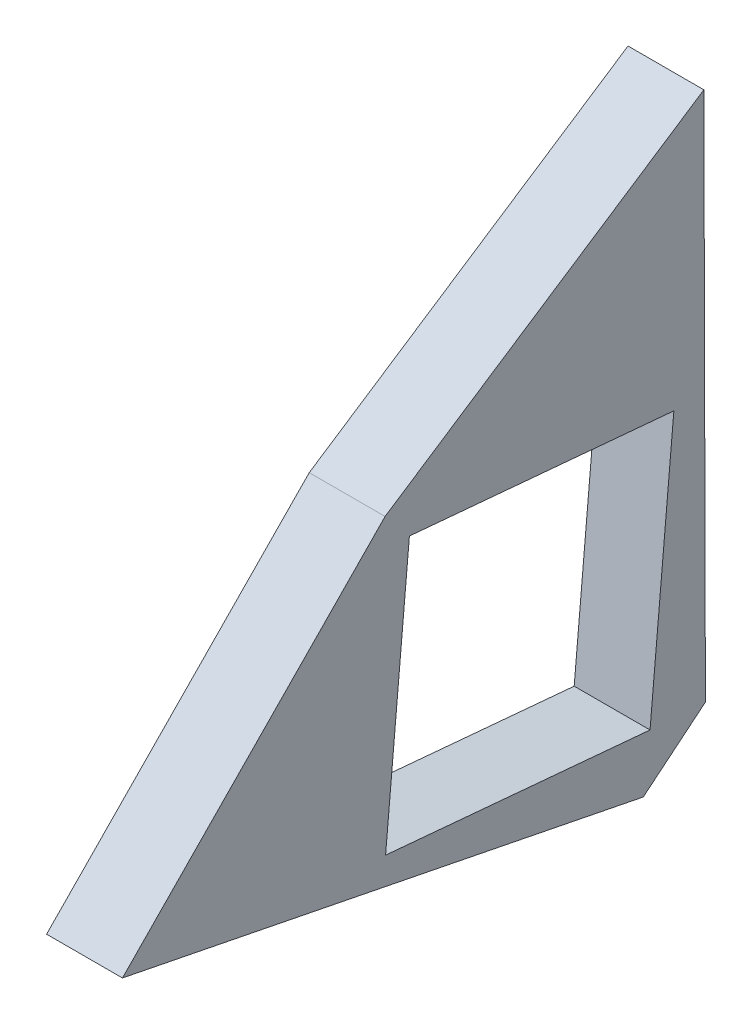
ISO-10303-21;
HEADER;
FILE_DESCRIPTION(('STEP AP214'),'2;1');
FILE_NAME('part.step','',(''),(''),'','','');
FILE_SCHEMA(('AUTOMOTIVE_DESIGN { 1 0 10303 214 1 1 1 1 }'));
ENDSEC;
DATA;
#1=APPLICATION_CONTEXT('core data for automotive mechanical design processes');
#2=APPLICATION_PROTOCOL_DEFINITION('international standard','automotive_design',2000,#1);
#3=PRODUCT_CONTEXT('',#1,'mechanical');
#4=PRODUCT('Part','Part','',(#3));
#5=PRODUCT_RELATED_PRODUCT_CATEGORY('part','',(#4));
#6=PRODUCT_DEFINITION_FORMATION('','',#4);
#7=PRODUCT_DEFINITION_CONTEXT('part definition',#1,'design');
#8=PRODUCT_DEFINITION('design','',#6,#7);
#9=PRODUCT_DEFINITION_SHAPE('','',#8);
#10=(LENGTH_UNIT() NAMED_UNIT(*) SI_UNIT(.MILLI.,.METRE.));
#11=(NAMED_UNIT(*) PLANE_ANGLE_UNIT() SI_UNIT($,.RADIAN.));
#12=(NAMED_UNIT(*) SI_UNIT($,.STERADIAN.) SOLID_ANGLE_UNIT());
#13=UNCERTAINTY_MEASURE_WITH_UNIT(LENGTH_MEASURE(1.E-05),#10,'distance_accuracy_value','');
#14=(GEOMETRIC_REPRESENTATION_CONTEXT(3) GLOBAL_UNCERTAINTY_ASSIGNED_CONTEXT((#13)) GLOBAL_UNIT_ASSIGNED_CONTEXT((#10,
#11,#12)) REPRESENTATION_CONTEXT('',''));
#15=CARTESIAN_POINT('',(0.,0.,0.));
#16=DIRECTION('',(0.,0.,1.));
#17=DIRECTION('',(1.,0.,0.));
#18=AXIS2_PLACEMENT_3D('',#15,#16,#17);
#19=CARTESIAN_POINT('',(4.00000000011332,0.,0.));
#20=DIRECTION('',(1.,0.,0.));
#21=DIRECTION('',(0.,1.,0.));
#22=AXIS2_PLACEMENT_3D('',#19,#20,#21);
#23=PLANE('',#22);
#24=DIRECTION('',(0.,0.195238956565087,0.980755703444735));
#25=VECTOR('',#24,1.);
#26=CARTESIAN_POINT('',(4.00000000011326,-12.2359621531208,-3.39641834524961));
#27=LINE('',#26,#25);
#28=CARTESIAN_POINT('',(4.00000000011326,-12.2359621531208,-3.39641834524961));
#29=VERTEX_POINT('',#28);
#30=CARTESIAN_POINT('',(4.00000000011333,-6.76927136930034,24.0647413511931));
#31=VERTEX_POINT('',#30);
#32=EDGE_CURVE('E45',#29,#31,#27,.T.);
#33=ORIENTED_EDGE('',*,*,#32,.F.);
#34=DIRECTION('',(0.,-0.635389526853681,0.772191782632175));
#35=VECTOR('',#34,1.);
#36=CARTESIAN_POINT('',(4.0000000001133,-9.54023269249155,-6.6725506227285));
#37=LINE('',#36,#35);
#38=CARTESIAN_POINT('',(4.0000000001133,-9.54023269249155,-6.6725506227285));
#39=VERTEX_POINT('',#38);
#40=EDGE_CURVE('E122',#39,#29,#37,.T.);
#41=ORIENTED_EDGE('',*,*,#40,.F.);
#42=DIRECTION('',(0.,-0.999995813600607,-0.00289357586033156));
#43=VECTOR('',#42,1.);
#44=CARTESIAN_POINT('',(4.00000000011369,18.4596500883253,-6.59153049863922));
#45=LINE('',#44,#43);
#46=CARTESIAN_POINT('',(4.00000000011369,18.4596500883253,-6.59153049863922));
#47=VERTEX_POINT('',#46);
#48=EDGE_CURVE('E164',#47,#39,#45,.T.);
#49=ORIENTED_EDGE('',*,*,#48,.F.);
#50=DIRECTION('',(0.,0.550297121991585,-0.834968908120403));
#51=VECTOR('',#50,1.);
#52=CARTESIAN_POINT('',(4.00000000011369,18.4596500883253,-6.59153049863922));
#53=LINE('',#52,#51);
#54=CARTESIAN_POINT('',(4.00000000011353,7.38216902263471,10.2163936218245));
#55=VERTEX_POINT('',#54);
#56=EDGE_CURVE('E199',#55,#47,#53,.T.);
#57=ORIENTED_EDGE('',*,*,#56,.F.);
#58=DIRECTION('',(0.,0.714719211713891,-0.699411501483264));
#59=VECTOR('',#58,1.);
#60=CARTESIAN_POINT('',(4.00000000011353,7.38216902263471,10.2163936218245));
#61=LINE('',#60,#59);
#62=EDGE_CURVE('E179',#31,#55,#61,.T.);
#63=ORIENTED_EDGE('',*,*,#62,.F.);
#64=EDGE_LOOP('',(#33,#41,#49,#57,#63));
#65=FACE_BOUND('',#64,.T.);
#66=DIRECTION('',(0.,0.995967843660256,-0.0897109491352087));
#67=VECTOR('',#66,1.);
#68=CARTESIAN_POINT('',(4.00000000011351,5.84678734948251,8.93475283059304));
#69=LINE('',#68,#67);
#70=CARTESIAN_POINT('',(4.0000000001133,-8.09676246176107,10.190706118486));
#71=VERTEX_POINT('',#70);
#72=CARTESIAN_POINT('',(4.00000000011351,5.84678734948251,8.93475283059304));
#73=VERTEX_POINT('',#72);
#74=EDGE_CURVE('E148',#71,#73,#69,.T.);
#75=ORIENTED_EDGE('',*,*,#74,.T.);
#76=DIRECTION('',(0.,-0.0897109491352088,-0.995967843660256));
#77=VECTOR('',#76,1.);
#78=CARTESIAN_POINT('',(4.00000000011351,4.59083406158959,-5.00879698065055));
#79=LINE('',#78,#77);
#80=CARTESIAN_POINT('',(4.00000000011351,4.59083406158959,-5.00879698065055));
#81=VERTEX_POINT('',#80);
#82=EDGE_CURVE('E135',#73,#81,#79,.T.);
#83=ORIENTED_EDGE('',*,*,#82,.T.);
#84=DIRECTION('',(0.,-0.995967843660256,0.0897109491352097));
#85=VECTOR('',#84,1.);
#86=CARTESIAN_POINT('',(4.00000000011351,4.59083406158959,-5.00879698065055));
#87=LINE('',#86,#85);
#88=CARTESIAN_POINT('',(4.0000000001132,-9.35271574965399,-3.75284369275761));
#89=VERTEX_POINT('',#88);
#90=EDGE_CURVE('E123',#81,#89,#87,.T.);
#91=ORIENTED_EDGE('',*,*,#90,.T.);
#92=DIRECTION('',(0.,0.0897109491352086,0.995967843660256));
#93=VECTOR('',#92,1.);
#94=CARTESIAN_POINT('',(4.0000000001133,-9.35271574965399,-3.75284369275761));
#95=LINE('',#94,#93);
#96=EDGE_CURVE('E53',#89,#71,#95,.T.);
#97=ORIENTED_EDGE('',*,*,#96,.T.);
#98=EDGE_LOOP('',(#75,#83,#91,#97));
#99=FACE_BOUND('',#98,.T.);
#100=ADVANCED_FACE('F37',(#65,#99),#23,.T.);
#101=CARTESIAN_POINT('',(1.13322971756654E-10,0.,0.));
#102=DIRECTION('',(1.,0.,0.));
#103=DIRECTION('',(0.,1.,0.));
#104=AXIS2_PLACEMENT_3D('',#101,#102,#103);
#105=PLANE('',#104);
#106=DIRECTION('',(0.,0.195238956565087,0.980755703444735));
#107=VECTOR('',#106,1.);
#108=CARTESIAN_POINT('',(1.13261718405955E-10,-12.2359621531208,-3.39641834524961));
#109=LINE('',#108,#107);
#110=CARTESIAN_POINT('',(1.13261718405955E-10,-12.2359621531208,-3.39641834524961));
#111=VERTEX_POINT('',#110);
#112=CARTESIAN_POINT('',(1.13333813892035E-10,-6.76927136930034,24.0647413511931));
#113=VERTEX_POINT('',#112);
#114=EDGE_CURVE('E12',#111,#113,#109,.T.);
#115=ORIENTED_EDGE('',*,*,#114,.T.);
#116=DIRECTION('',(0.,0.714719211713891,-0.699411501483264));
#117=VECTOR('',#116,1.);
#118=CARTESIAN_POINT('',(1.13533143905012E-10,7.38216902263471,10.2163936218245));
#119=LINE('',#118,#117);
#120=CARTESIAN_POINT('',(1.13533143905012E-10,7.38216902263471,10.2163936218245));
#121=VERTEX_POINT('',#120);
#122=EDGE_CURVE('E178',#113,#121,#119,.T.);
#123=ORIENTED_EDGE('',*,*,#122,.T.);
#124=DIRECTION('',(0.,0.550297121991585,-0.834968908120403));
#125=VECTOR('',#124,1.);
#126=CARTESIAN_POINT('',(1.13688853541484E-10,18.4596500883253,-6.59153049863922));
#127=LINE('',#126,#125);
#128=CARTESIAN_POINT('',(1.13688853541484E-10,18.4596500883253,-6.59153049863922));
#129=VERTEX_POINT('',#128);
#130=EDGE_CURVE('E193',#121,#129,#127,.T.);
#131=ORIENTED_EDGE('',*,*,#130,.T.);
#132=DIRECTION('',(0.,-0.999995813600607,-0.00289357586033156));
#133=VECTOR('',#132,1.);
#134=CARTESIAN_POINT('',(1.13688853541484E-10,18.4596500883253,-6.59153049863922));
#135=LINE('',#134,#133);
#136=CARTESIAN_POINT('',(1.13298889235523E-10,-9.54023269249155,-6.6725506227285));
#137=VERTEX_POINT('',#136);
#138=EDGE_CURVE('E207',#129,#137,#135,.T.);
#139=ORIENTED_EDGE('',*,*,#138,.T.);
#140=DIRECTION('',(0.,-0.635389526853681,0.772191782632175));
#141=VECTOR('',#140,1.);
#142=CARTESIAN_POINT('',(1.13298889235523E-10,-9.54023269249155,-6.6725506227285));
#143=LINE('',#142,#141);
#144=EDGE_CURVE('E165',#137,#111,#143,.T.);
#145=ORIENTED_EDGE('',*,*,#144,.T.);
#146=EDGE_LOOP('',(#115,#123,#131,#139,#145));
#147=FACE_BOUND('',#146,.T.);
#148=DIRECTION('',(0.,-0.0897109491352088,-0.995967843660256));
#149=VECTOR('',#148,1.);
#150=CARTESIAN_POINT('',(1.1351104069263E-10,4.59083406158959,-5.00879698065055));
#151=LINE('',#150,#149);
#152=CARTESIAN_POINT('',(1.13511888855576E-10,5.84678734948251,8.93475283059304));
#153=VERTEX_POINT('',#152);
#154=CARTESIAN_POINT('',(1.13342295141306E-10,4.59083406158959,-5.00879698065055));
#155=VERTEX_POINT('',#154);
#156=EDGE_CURVE('E61',#153,#155,#151,.T.);
#157=ORIENTED_EDGE('',*,*,#156,.F.);
#158=DIRECTION('',(0.,0.995967843660256,-0.0897109491352087));
#159=VECTOR('',#158,1.);
#160=CARTESIAN_POINT('',(1.13511888855576E-10,5.84678734948251,8.93475283059304));
#161=LINE('',#160,#159);
#162=CARTESIAN_POINT('',(1.13301732027774E-10,-8.09676246176107,10.190706118486));
#163=VERTEX_POINT('',#162);
#164=EDGE_CURVE('E127',#163,#153,#161,.T.);
#165=ORIENTED_EDGE('',*,*,#164,.F.);
#166=DIRECTION('',(0.,0.0897109491352086,0.995967843660256));
#167=VECTOR('',#166,1.);
#168=CARTESIAN_POINT('',(1.13301474601315E-10,-9.35271574965399,-3.75284369275761));
#169=LINE('',#168,#167);
#170=CARTESIAN_POINT('',(1.13301474601315E-10,-9.35271574965399,-3.75284369275761));
#171=VERTEX_POINT('',#170);
#172=EDGE_CURVE('E111',#171,#163,#169,.T.);
#173=ORIENTED_EDGE('',*,*,#172,.F.);
#174=DIRECTION('',(0.,-0.995967843660256,0.0897109491352097));
#175=VECTOR('',#174,1.);
#176=CARTESIAN_POINT('',(1.1351104069263E-10,4.59083406158959,-5.00879698065055));
#177=LINE('',#176,#175);
#178=EDGE_CURVE('E118',#155,#171,#177,.T.);
#179=ORIENTED_EDGE('',*,*,#178,.F.);
#180=EDGE_LOOP('',(#157,#165,#173,#179));
#181=FACE_BOUND('',#180,.T.);
#182=ADVANCED_FACE('F125',(#147,#181),#105,.F.);
#183=CARTESIAN_POINT('',(1.13298889235523E-10,-9.54023269249155,-6.6725506227285));
#184=DIRECTION('',(0.,0.772191782632175,0.635389526853681));
#185=DIRECTION('',(0.,-0.635389526853681,0.772191782632175));
#186=AXIS2_PLACEMENT_3D('',#183,#184,#185);
#187=PLANE('',#186);
#188=ORIENTED_EDGE('',*,*,#40,.T.);
#189=DIRECTION('',(1.,0.,0.));
#190=VECTOR('',#189,1.);
#191=CARTESIAN_POINT('',(1.13261718405955E-10,-12.2359621531208,-3.39641834524961));
#192=LINE('',#191,#190);
#193=EDGE_CURVE('E161',#111,#29,#192,.T.);
#194=ORIENTED_EDGE('',*,*,#193,.F.);
#195=ORIENTED_EDGE('',*,*,#144,.F.);
#196=DIRECTION('',(1.,0.,0.));
#197=VECTOR('',#196,1.);
#198=CARTESIAN_POINT('',(1.13298889235523E-10,-9.54023269249155,-6.6725506227285));
#199=LINE('',#198,#197);
#200=EDGE_CURVE('E170',#137,#39,#199,.T.);
#201=ORIENTED_EDGE('',*,*,#200,.T.);
#202=EDGE_LOOP('',(#188,#194,#195,#201));
#203=FACE_BOUND('',#202,.T.);
#204=ADVANCED_FACE('F225',(#203),#187,.F.);
#205=CARTESIAN_POINT('',(1.13688853541484E-10,18.4596500883253,-6.59153049863922));
#206=DIRECTION('',(0.,-0.00289357586033156,0.999995813600607));
#207=DIRECTION('',(0.,-0.999995813600607,-0.00289357586033156));
#208=AXIS2_PLACEMENT_3D('',#205,#206,#207);
#209=PLANE('',#208);
#210=ORIENTED_EDGE('',*,*,#48,.T.);
#211=ORIENTED_EDGE('',*,*,#200,.F.);
#212=ORIENTED_EDGE('',*,*,#138,.F.);
#213=DIRECTION('',(1.,0.,0.));
#214=VECTOR('',#213,1.);
#215=CARTESIAN_POINT('',(1.13688853541484E-10,18.4596500883253,-6.59153049863922));
#216=LINE('',#215,#214);
#217=EDGE_CURVE('E210',#129,#47,#216,.T.);
#218=ORIENTED_EDGE('',*,*,#217,.T.);
#219=EDGE_LOOP('',(#210,#211,#212,#218));
#220=FACE_BOUND('',#219,.T.);
#221=ADVANCED_FACE('F242',(#220),#209,.F.);
#222=CARTESIAN_POINT('',(1.13688853541484E-10,18.4596500883253,-6.59153049863922));
#223=DIRECTION('',(0.,-0.834968908120403,-0.550297121991585));
#224=DIRECTION('',(0.,0.550297121991586,-0.834968908120403));
#225=AXIS2_PLACEMENT_3D('',#222,#223,#224);
#226=PLANE('',#225);
#227=ORIENTED_EDGE('',*,*,#56,.T.);
#228=ORIENTED_EDGE('',*,*,#217,.F.);
#229=ORIENTED_EDGE('',*,*,#130,.F.);
#230=DIRECTION('',(1.,0.,0.));
#231=VECTOR('',#230,1.);
#232=CARTESIAN_POINT('',(1.13533143905012E-10,7.38216902263471,10.2163936218245));
#233=LINE('',#232,#231);
#234=EDGE_CURVE('E196',#121,#55,#233,.T.);
#235=ORIENTED_EDGE('',*,*,#234,.T.);
#236=EDGE_LOOP('',(#227,#228,#229,#235));
#237=FACE_BOUND('',#236,.T.);
#238=ADVANCED_FACE('F244',(#237),#226,.F.);
#239=CARTESIAN_POINT('',(1.13533143905012E-10,7.38216902263471,10.2163936218245));
#240=DIRECTION('',(0.,-0.699411501483264,-0.714719211713891));
#241=DIRECTION('',(0.,0.714719211713891,-0.699411501483264));
#242=AXIS2_PLACEMENT_3D('',#239,#240,#241);
#243=PLANE('',#242);
#244=ORIENTED_EDGE('',*,*,#62,.T.);
#245=ORIENTED_EDGE('',*,*,#234,.F.);
#246=ORIENTED_EDGE('',*,*,#122,.F.);
#247=DIRECTION('',(1.,0.,0.));
#248=VECTOR('',#247,1.);
#249=CARTESIAN_POINT('',(1.13333813892035E-10,-6.76927136930034,24.0647413511931));
#250=LINE('',#249,#248);
#251=EDGE_CURVE('E175',#113,#31,#250,.T.);
#252=ORIENTED_EDGE('',*,*,#251,.T.);
#253=EDGE_LOOP('',(#244,#245,#246,#252));
#254=FACE_BOUND('',#253,.T.);
#255=ADVANCED_FACE('F238',(#254),#243,.F.);
#256=CARTESIAN_POINT('',(1.13261718405955E-10,-12.2359621531208,-3.39641834524961));
#257=DIRECTION('',(0.,0.980755703444734,-0.195238956565087));
#258=DIRECTION('',(0.,0.195238956565087,0.980755703444735));
#259=AXIS2_PLACEMENT_3D('',#256,#257,#258);
#260=PLANE('',#259);
#261=ORIENTED_EDGE('',*,*,#32,.T.);
#262=ORIENTED_EDGE('',*,*,#251,.F.);
#263=ORIENTED_EDGE('',*,*,#114,.F.);
#264=ORIENTED_EDGE('',*,*,#193,.T.);
#265=EDGE_LOOP('',(#261,#262,#263,#264));
#266=FACE_BOUND('',#265,.T.);
#267=ADVANCED_FACE('F236',(#266),#260,.F.);
#268=CARTESIAN_POINT('',(1.1351104069263E-10,4.59083406158959,-5.00879698065055));
#269=DIRECTION('',(0.,-0.995967843660256,0.0897109491352088));
#270=DIRECTION('',(0.,-0.0897109491352088,-0.995967843660256));
#271=AXIS2_PLACEMENT_3D('',#268,#269,#270);
#272=PLANE('',#271);
#273=ORIENTED_EDGE('',*,*,#82,.F.);
#274=DIRECTION('',(1.,0.,0.));
#275=VECTOR('',#274,1.);
#276=CARTESIAN_POINT('',(1.13511888855576E-10,5.84678734948251,8.93475283059304));
#277=LINE('',#276,#275);
#278=EDGE_CURVE('E138',#153,#73,#277,.T.);
#279=ORIENTED_EDGE('',*,*,#278,.F.);
#280=ORIENTED_EDGE('',*,*,#156,.T.);
#281=DIRECTION('',(1.,0.,0.));
#282=VECTOR('',#281,1.);
#283=CARTESIAN_POINT('',(1.1351104069263E-10,4.59083406158959,-5.00879698065055));
#284=LINE('',#283,#282);
#285=EDGE_CURVE('E120',#155,#81,#284,.T.);
#286=ORIENTED_EDGE('',*,*,#285,.T.);
#287=EDGE_LOOP('',(#273,#279,#280,#286));
#288=FACE_BOUND('',#287,.T.);
#289=ADVANCED_FACE('F263',(#288),#272,.T.);
#290=CARTESIAN_POINT('',(1.13511888855576E-10,5.84678734948251,8.93475283059304));
#291=DIRECTION('',(0.,-0.0897109491352087,-0.995967843660256));
#292=DIRECTION('',(0.,0.995967843660256,-0.0897109491352087));
#293=AXIS2_PLACEMENT_3D('',#290,#291,#292);
#294=PLANE('',#293);
#295=ORIENTED_EDGE('',*,*,#74,.F.);
#296=DIRECTION('',(1.,0.,0.));
#297=VECTOR('',#296,1.);
#298=CARTESIAN_POINT('',(1.13301732027774E-10,-8.09676246176107,10.190706118486));
#299=LINE('',#298,#297);
#300=EDGE_CURVE('E146',#163,#71,#299,.T.);
#301=ORIENTED_EDGE('',*,*,#300,.F.);
#302=ORIENTED_EDGE('',*,*,#164,.T.);
#303=ORIENTED_EDGE('',*,*,#278,.T.);
#304=EDGE_LOOP('',(#295,#301,#302,#303));
#305=FACE_BOUND('',#304,.T.);
#306=ADVANCED_FACE('F267',(#305),#294,.T.);
#307=CARTESIAN_POINT('',(1.13301474601315E-10,-9.35271574965399,-3.75284369275761));
#308=DIRECTION('',(0.,0.995967843660256,-0.0897109491352086));
#309=DIRECTION('',(0.,0.0897109491352086,0.995967843660256));
#310=AXIS2_PLACEMENT_3D('',#307,#308,#309);
#311=PLANE('',#310);
#312=ORIENTED_EDGE('',*,*,#96,.F.);
#313=DIRECTION('',(1.,0.,0.));
#314=VECTOR('',#313,1.);
#315=CARTESIAN_POINT('',(1.13301474601315E-10,-9.35271574965399,-3.75284369275761));
#316=LINE('',#315,#314);
#317=EDGE_CURVE('E107',#171,#89,#316,.T.);
#318=ORIENTED_EDGE('',*,*,#317,.F.);
#319=ORIENTED_EDGE('',*,*,#172,.T.);
#320=ORIENTED_EDGE('',*,*,#300,.T.);
#321=EDGE_LOOP('',(#312,#318,#319,#320));
#322=FACE_BOUND('',#321,.T.);
#323=ADVANCED_FACE('F109',(#322),#311,.T.);
#324=CARTESIAN_POINT('',(1.1351104069263E-10,4.59083406158959,-5.00879698065055));
#325=DIRECTION('',(0.,0.0897109491352097,0.995967843660256));
#326=DIRECTION('',(0.,-0.995967843660256,0.0897109491352097));
#327=AXIS2_PLACEMENT_3D('',#324,#325,#326);
#328=PLANE('',#327);
#329=ORIENTED_EDGE('',*,*,#90,.F.);
#330=ORIENTED_EDGE('',*,*,#285,.F.);
#331=ORIENTED_EDGE('',*,*,#178,.T.);
#332=ORIENTED_EDGE('',*,*,#317,.T.);
#333=EDGE_LOOP('',(#329,#330,#331,#332));
#334=FACE_BOUND('',#333,.T.);
#335=ADVANCED_FACE('F119',(#334),#328,.T.);
#336=CLOSED_SHELL('',(#100,#182,#204,#221,#238,#255,#267,#289,#306,#323,#335));
#337=MANIFOLD_SOLID_BREP('B2',#336);
#338=ADVANCED_BREP_SHAPE_REPRESENTATION('',(#18,#337),#14);
#339=SHAPE_DEFINITION_REPRESENTATION(#9,#338);
ENDSEC;
END-ISO-10303-21;
